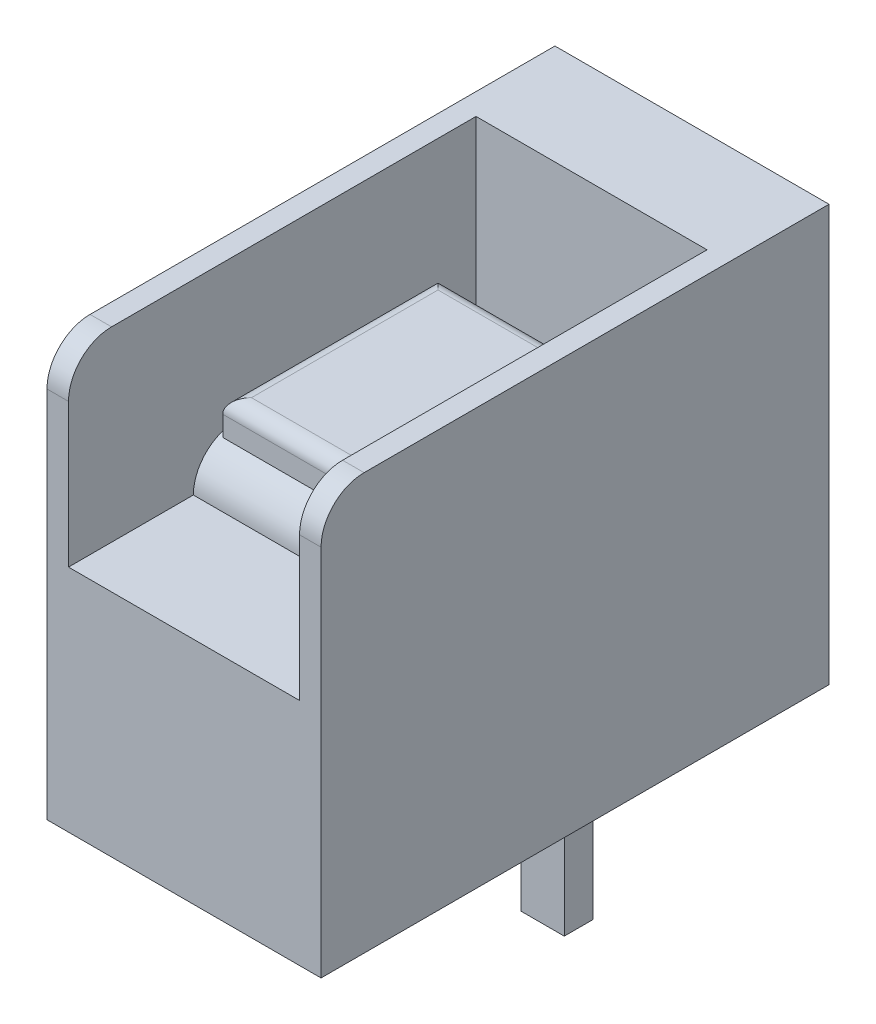
ISO-10303-21;
HEADER;
FILE_DESCRIPTION(('STEP AP214'),'2;1');
FILE_NAME('part.step','',(''),(''),'','','');
FILE_SCHEMA(('AUTOMOTIVE_DESIGN { 1 0 10303 214 1 1 1 1 }'));
ENDSEC;
DATA;
#1=APPLICATION_CONTEXT('core data for automotive mechanical design processes');
#2=APPLICATION_PROTOCOL_DEFINITION('international standard','automotive_design',2000,#1);
#3=PRODUCT_CONTEXT('',#1,'mechanical');
#4=PRODUCT('Part','Part','',(#3));
#5=PRODUCT_RELATED_PRODUCT_CATEGORY('part','',(#4));
#6=PRODUCT_DEFINITION_FORMATION('','',#4);
#7=PRODUCT_DEFINITION_CONTEXT('part definition',#1,'design');
#8=PRODUCT_DEFINITION('design','',#6,#7);
#9=PRODUCT_DEFINITION_SHAPE('','',#8);
#10=(LENGTH_UNIT() NAMED_UNIT(*) SI_UNIT(.MILLI.,.METRE.));
#11=(NAMED_UNIT(*) PLANE_ANGLE_UNIT() SI_UNIT($,.RADIAN.));
#12=(NAMED_UNIT(*) SI_UNIT($,.STERADIAN.) SOLID_ANGLE_UNIT());
#13=UNCERTAINTY_MEASURE_WITH_UNIT(LENGTH_MEASURE(1.E-05),#10,'distance_accuracy_value','');
#14=(GEOMETRIC_REPRESENTATION_CONTEXT(3) GLOBAL_UNCERTAINTY_ASSIGNED_CONTEXT((#13)) GLOBAL_UNIT_ASSIGNED_CONTEXT((#10,
#11,#12)) REPRESENTATION_CONTEXT('',''));
#15=CARTESIAN_POINT('',(0.,0.,0.));
#16=DIRECTION('',(0.,0.,1.));
#17=DIRECTION('',(1.,0.,0.));
#18=AXIS2_PLACEMENT_3D('',#15,#16,#17);
#19=CARTESIAN_POINT('',(-4.775,0.,8.85));
#20=DIRECTION('',(0.,1.,0.));
#21=DIRECTION('',(0.,0.,1.));
#22=AXIS2_PLACEMENT_3D('',#19,#20,#21);
#23=PLANE('',#22);
#24=DIRECTION('',(-1.,0.,0.));
#25=VECTOR('',#24,1.);
#26=CARTESIAN_POINT('',(4.025,0.,-6.35));
#27=LINE('',#26,#25);
#28=CARTESIAN_POINT('',(4.025,0.,-6.35));
#29=VERTEX_POINT('',#28);
#30=CARTESIAN_POINT('',(-4.025,0.,-6.35));
#31=VERTEX_POINT('',#30);
#32=EDGE_CURVE('E303',#29,#31,#27,.T.);
#33=ORIENTED_EDGE('',*,*,#32,.F.);
#34=DIRECTION('',(0.,0.,-1.));
#35=VECTOR('',#34,1.);
#36=CARTESIAN_POINT('',(4.025,0.,-6.35));
#37=LINE('',#36,#35);
#38=CARTESIAN_POINT('',(4.025,0.,-8.85));
#39=VERTEX_POINT('',#38);
#40=EDGE_CURVE('E313',#29,#39,#37,.T.);
#41=ORIENTED_EDGE('',*,*,#40,.T.);
#42=DIRECTION('',(-1.,0.,0.));
#43=VECTOR('',#42,1.);
#44=CARTESIAN_POINT('',(-4.775,0.,-8.85));
#45=LINE('',#44,#43);
#46=CARTESIAN_POINT('',(4.775,0.,-8.85));
#47=VERTEX_POINT('',#46);
#48=EDGE_CURVE('E366',#47,#39,#45,.T.);
#49=ORIENTED_EDGE('',*,*,#48,.F.);
#50=DIRECTION('',(0.,0.,-1.));
#51=VECTOR('',#50,1.);
#52=CARTESIAN_POINT('',(4.775,0.,-8.85));
#53=LINE('',#52,#51);
#54=CARTESIAN_POINT('',(4.775,0.,8.85));
#55=VERTEX_POINT('',#54);
#56=EDGE_CURVE('E376',#55,#47,#53,.T.);
#57=ORIENTED_EDGE('',*,*,#56,.F.);
#58=DIRECTION('',(1.,0.,0.));
#59=VECTOR('',#58,1.);
#60=CARTESIAN_POINT('',(-4.775,0.,8.85));
#61=LINE('',#60,#59);
#62=CARTESIAN_POINT('',(-4.775,0.,8.85));
#63=VERTEX_POINT('',#62);
#64=EDGE_CURVE('E373',#63,#55,#61,.T.);
#65=ORIENTED_EDGE('',*,*,#64,.F.);
#66=DIRECTION('',(0.,0.,1.));
#67=VECTOR('',#66,1.);
#68=CARTESIAN_POINT('',(-4.775,0.,-8.85));
#69=LINE('',#68,#67);
#70=CARTESIAN_POINT('',(-4.775,0.,-8.85));
#71=VERTEX_POINT('',#70);
#72=EDGE_CURVE('E354',#71,#63,#69,.T.);
#73=ORIENTED_EDGE('',*,*,#72,.F.);
#74=CARTESIAN_POINT('',(-4.025,0.,-8.85));
#75=VERTEX_POINT('',#74);
#76=EDGE_CURVE('E378',#75,#71,#45,.T.);
#77=ORIENTED_EDGE('',*,*,#76,.F.);
#78=DIRECTION('',(0.,0.,-1.));
#79=VECTOR('',#78,1.);
#80=CARTESIAN_POINT('',(-4.025,0.,-6.35));
#81=LINE('',#80,#79);
#82=EDGE_CURVE('E325',#31,#75,#81,.T.);
#83=ORIENTED_EDGE('',*,*,#82,.F.);
#84=EDGE_LOOP('',(#33,#41,#49,#57,#65,#73,#77,#83));
#85=FACE_BOUND('',#84,.T.);
#86=DIRECTION('',(0.,0.,-1.));
#87=VECTOR('',#86,1.);
#88=CARTESIAN_POINT('',(-0.749999999999998,0.,-3.65));
#89=LINE('',#88,#87);
#90=CARTESIAN_POINT('',(-0.749999999999998,0.,-3.65));
#91=VERTEX_POINT('',#90);
#92=CARTESIAN_POINT('',(-0.749999999999998,0.,-4.65));
#93=VERTEX_POINT('',#92);
#94=EDGE_CURVE('E253',#91,#93,#89,.T.);
#95=ORIENTED_EDGE('',*,*,#94,.F.);
#96=DIRECTION('',(-1.,0.,0.));
#97=VECTOR('',#96,1.);
#98=CARTESIAN_POINT('',(-0.749999999999998,0.,-3.65));
#99=LINE('',#98,#97);
#100=CARTESIAN_POINT('',(0.750000000000002,0.,-3.65));
#101=VERTEX_POINT('',#100);
#102=EDGE_CURVE('E250',#101,#91,#99,.T.);
#103=ORIENTED_EDGE('',*,*,#102,.F.);
#104=DIRECTION('',(0.,0.,1.));
#105=VECTOR('',#104,1.);
#106=CARTESIAN_POINT('',(0.750000000000002,0.,-3.65));
#107=LINE('',#106,#105);
#108=CARTESIAN_POINT('',(0.750000000000002,0.,-4.65));
#109=VERTEX_POINT('',#108);
#110=EDGE_CURVE('E57',#109,#101,#107,.T.);
#111=ORIENTED_EDGE('',*,*,#110,.F.);
#112=DIRECTION('',(1.,0.,0.));
#113=VECTOR('',#112,1.);
#114=CARTESIAN_POINT('',(-0.749999999999998,0.,-4.65));
#115=LINE('',#114,#113);
#116=EDGE_CURVE('E52',#93,#109,#115,.T.);
#117=ORIENTED_EDGE('',*,*,#116,.F.);
#118=EDGE_LOOP('',(#95,#103,#111,#117));
#119=FACE_BOUND('',#118,.T.);
#120=ADVANCED_FACE('F35',(#85,#119),#23,.F.);
#121=CARTESIAN_POINT('',(4.025,9.5,-4.5));
#122=DIRECTION('',(0.,-1.,0.));
#123=DIRECTION('',(0.,0.,-1.));
#124=AXIS2_PLACEMENT_3D('',#121,#122,#123);
#125=PLANE('',#124);
#126=DIRECTION('',(0.,0.,-1.));
#127=VECTOR('',#126,1.);
#128=CARTESIAN_POINT('',(3.75,9.5,3.75));
#129=LINE('',#128,#127);
#130=CARTESIAN_POINT('',(3.75,9.5,3.));
#131=VERTEX_POINT('',#130);
#132=CARTESIAN_POINT('',(3.75,9.5,-3.));
#133=VERTEX_POINT('',#132);
#134=EDGE_CURVE('E266',#131,#133,#129,.T.);
#135=ORIENTED_EDGE('',*,*,#134,.F.);
#136=DIRECTION('',(1.,0.,0.));
#137=VECTOR('',#136,1.);
#138=CARTESIAN_POINT('',(4.025,9.5,3.));
#139=LINE('',#138,#137);
#140=CARTESIAN_POINT('',(4.025,9.5,3.));
#141=VERTEX_POINT('',#140);
#142=EDGE_CURVE('E408',#131,#141,#139,.T.);
#143=ORIENTED_EDGE('',*,*,#142,.T.);
#144=DIRECTION('',(0.,0.,-1.));
#145=VECTOR('',#144,1.);
#146=CARTESIAN_POINT('',(4.025,9.5,-4.5));
#147=LINE('',#146,#145);
#148=CARTESIAN_POINT('',(4.025,9.5,-3.));
#149=VERTEX_POINT('',#148);
#150=EDGE_CURVE('E289',#141,#149,#147,.T.);
#151=ORIENTED_EDGE('',*,*,#150,.T.);
#152=DIRECTION('',(-1.,0.,0.));
#153=VECTOR('',#152,1.);
#154=CARTESIAN_POINT('',(4.025,9.5,-3.));
#155=LINE('',#154,#153);
#156=EDGE_CURVE('E414',#149,#133,#155,.T.);
#157=ORIENTED_EDGE('',*,*,#156,.T.);
#158=EDGE_LOOP('',(#135,#143,#151,#157));
#159=FACE_BOUND('',#158,.T.);
#160=ADVANCED_FACE('F462',(#159),#125,.F.);
#161=DIRECTION('',(0.,0.,1.));
#162=VECTOR('',#161,1.);
#163=CARTESIAN_POINT('',(-3.75,9.5,3.75));
#164=LINE('',#163,#162);
#165=CARTESIAN_POINT('',(-3.75,9.5,-3.));
#166=VERTEX_POINT('',#165);
#167=CARTESIAN_POINT('',(-3.75,9.5,3.));
#168=VERTEX_POINT('',#167);
#169=EDGE_CURVE('E275',#166,#168,#164,.T.);
#170=ORIENTED_EDGE('',*,*,#169,.F.);
#171=CARTESIAN_POINT('',(-4.025,9.5,-3.));
#172=VERTEX_POINT('',#171);
#173=EDGE_CURVE('E412',#166,#172,#155,.T.);
#174=ORIENTED_EDGE('',*,*,#173,.T.);
#175=DIRECTION('',(0.,0.,1.));
#176=VECTOR('',#175,1.);
#177=CARTESIAN_POINT('',(-4.025,9.5,-4.5));
#178=LINE('',#177,#176);
#179=CARTESIAN_POINT('',(-4.025,9.5,3.));
#180=VERTEX_POINT('',#179);
#181=EDGE_CURVE('E292',#172,#180,#178,.T.);
#182=ORIENTED_EDGE('',*,*,#181,.T.);
#183=EDGE_CURVE('E409',#180,#168,#139,.T.);
#184=ORIENTED_EDGE('',*,*,#183,.T.);
#185=EDGE_LOOP('',(#170,#174,#182,#184));
#186=FACE_BOUND('',#185,.T.);
#187=ADVANCED_FACE('F476',(#186),#125,.F.);
#188=CARTESIAN_POINT('',(4.025,8.,8.85));
#189=DIRECTION('',(1.,0.,0.));
#190=DIRECTION('',(0.,0.,-1.));
#191=AXIS2_PLACEMENT_3D('',#188,#189,#190);
#192=PLANE('',#191);
#193=DIRECTION('',(0.,0.,-1.));
#194=VECTOR('',#193,1.);
#195=CARTESIAN_POINT('',(4.025,8.,8.85));
#196=LINE('',#195,#194);
#197=CARTESIAN_POINT('',(4.025,8.,-4.5));
#198=VERTEX_POINT('',#197);
#199=CARTESIAN_POINT('',(4.025,8.,-5.35));
#200=VERTEX_POINT('',#199);
#201=EDGE_CURVE('E333',#198,#200,#196,.T.);
#202=ORIENTED_EDGE('',*,*,#201,.F.);
#203=CARTESIAN_POINT('',(4.025,8.,-3.));
#204=DIRECTION('',(1.,0.,0.));
#205=DIRECTION('',(0.,0.,-1.));
#206=AXIS2_PLACEMENT_3D('',#203,#204,#205);
#207=CIRCLE('',#206,1.5);
#208=EDGE_CURVE('E419',#198,#149,#207,.T.);
#209=ORIENTED_EDGE('',*,*,#208,.T.);
#210=ORIENTED_EDGE('',*,*,#150,.F.);
#211=CARTESIAN_POINT('',(4.025,8.,3.));
#212=DIRECTION('',(1.,0.,0.));
#213=DIRECTION('',(0.,0.,-1.));
#214=AXIS2_PLACEMENT_3D('',#211,#212,#213);
#215=CIRCLE('',#214,1.5);
#216=CARTESIAN_POINT('',(4.025,8.,4.5));
#217=VERTEX_POINT('',#216);
#218=EDGE_CURVE('E421',#141,#217,#215,.T.);
#219=ORIENTED_EDGE('',*,*,#218,.T.);
#220=CARTESIAN_POINT('',(4.025,8.,8.85));
#221=VERTEX_POINT('',#220);
#222=EDGE_CURVE('E329',#221,#217,#196,.T.);
#223=ORIENTED_EDGE('',*,*,#222,.F.);
#224=DIRECTION('',(0.,1.,0.));
#225=VECTOR('',#224,1.);
#226=CARTESIAN_POINT('',(4.025,8.,8.85));
#227=LINE('',#226,#225);
#228=CARTESIAN_POINT('',(4.025,13.,8.85));
#229=VERTEX_POINT('',#228);
#230=EDGE_CURVE('E351',#221,#229,#227,.T.);
#231=ORIENTED_EDGE('',*,*,#230,.T.);
#232=CARTESIAN_POINT('',(4.025,13.,7.35));
#233=DIRECTION('',(1.,0.,0.));
#234=DIRECTION('',(0.,0.,-1.));
#235=AXIS2_PLACEMENT_3D('',#232,#233,#234);
#236=CIRCLE('',#235,1.5);
#237=CARTESIAN_POINT('',(4.025,14.5,7.35));
#238=VERTEX_POINT('',#237);
#239=EDGE_CURVE('E402',#229,#238,#236,.F.);
#240=ORIENTED_EDGE('',*,*,#239,.T.);
#241=DIRECTION('',(0.,0.,-1.));
#242=VECTOR('',#241,1.);
#243=CARTESIAN_POINT('',(4.025,14.5,8.85));
#244=LINE('',#243,#242);
#245=CARTESIAN_POINT('',(4.025,14.5,-5.35));
#246=VERTEX_POINT('',#245);
#247=EDGE_CURVE('E322',#238,#246,#244,.T.);
#248=ORIENTED_EDGE('',*,*,#247,.T.);
#249=DIRECTION('',(0.,1.,0.));
#250=VECTOR('',#249,1.);
#251=CARTESIAN_POINT('',(4.025,8.,-5.35));
#252=LINE('',#251,#250);
#253=EDGE_CURVE('E343',#200,#246,#252,.T.);
#254=ORIENTED_EDGE('',*,*,#253,.F.);
#255=EDGE_LOOP('',(#202,#209,#210,#219,#223,#231,#240,#248,#254));
#256=FACE_BOUND('',#255,.T.);
#257=ADVANCED_FACE('F492',(#256),#192,.F.);
#258=CARTESIAN_POINT('',(-4.025,8.,8.85));
#259=DIRECTION('',(-1.,0.,0.));
#260=DIRECTION('',(0.,0.,1.));
#261=AXIS2_PLACEMENT_3D('',#258,#259,#260);
#262=PLANE('',#261);
#263=ORIENTED_EDGE('',*,*,#181,.F.);
#264=CARTESIAN_POINT('',(-4.025,8.,-3.));
#265=DIRECTION('',(-1.,0.,0.));
#266=DIRECTION('',(0.,0.,1.));
#267=AXIS2_PLACEMENT_3D('',#264,#265,#266);
#268=CIRCLE('',#267,1.5);
#269=CARTESIAN_POINT('',(-4.025,8.,-4.5));
#270=VERTEX_POINT('',#269);
#271=EDGE_CURVE('E417',#172,#270,#268,.T.);
#272=ORIENTED_EDGE('',*,*,#271,.T.);
#273=DIRECTION('',(0.,0.,1.));
#274=VECTOR('',#273,1.);
#275=CARTESIAN_POINT('',(-4.025,8.,8.85));
#276=LINE('',#275,#274);
#277=CARTESIAN_POINT('',(-4.025,8.,-5.35));
#278=VERTEX_POINT('',#277);
#279=EDGE_CURVE('E337',#278,#270,#276,.T.);
#280=ORIENTED_EDGE('',*,*,#279,.F.);
#281=DIRECTION('',(0.,1.,0.));
#282=VECTOR('',#281,1.);
#283=CARTESIAN_POINT('',(-4.025,8.,-5.35));
#284=LINE('',#283,#282);
#285=CARTESIAN_POINT('',(-4.025,14.5,-5.35));
#286=VERTEX_POINT('',#285);
#287=EDGE_CURVE('E358',#278,#286,#284,.T.);
#288=ORIENTED_EDGE('',*,*,#287,.T.);
#289=DIRECTION('',(0.,0.,1.));
#290=VECTOR('',#289,1.);
#291=CARTESIAN_POINT('',(-4.025,14.5,8.85));
#292=LINE('',#291,#290);
#293=CARTESIAN_POINT('',(-4.025,14.5,7.35));
#294=VERTEX_POINT('',#293);
#295=EDGE_CURVE('E348',#286,#294,#292,.T.);
#296=ORIENTED_EDGE('',*,*,#295,.T.);
#297=CARTESIAN_POINT('',(-4.025,13.,7.35));
#298=DIRECTION('',(-1.,0.,0.));
#299=DIRECTION('',(0.,0.,1.));
#300=AXIS2_PLACEMENT_3D('',#297,#298,#299);
#301=CIRCLE('',#300,1.5);
#302=CARTESIAN_POINT('',(-4.025,13.,8.85));
#303=VERTEX_POINT('',#302);
#304=EDGE_CURVE('E404',#294,#303,#301,.F.);
#305=ORIENTED_EDGE('',*,*,#304,.T.);
#306=DIRECTION('',(0.,1.,0.));
#307=VECTOR('',#306,1.);
#308=CARTESIAN_POINT('',(-4.025,8.,8.85));
#309=LINE('',#308,#307);
#310=CARTESIAN_POINT('',(-4.025,8.,8.85));
#311=VERTEX_POINT('',#310);
#312=EDGE_CURVE('E355',#311,#303,#309,.T.);
#313=ORIENTED_EDGE('',*,*,#312,.F.);
#314=CARTESIAN_POINT('',(-4.025,8.,4.5));
#315=VERTEX_POINT('',#314);
#316=EDGE_CURVE('E336',#315,#311,#276,.T.);
#317=ORIENTED_EDGE('',*,*,#316,.F.);
#318=CARTESIAN_POINT('',(-4.025,8.,3.));
#319=DIRECTION('',(-1.,0.,0.));
#320=DIRECTION('',(0.,0.,1.));
#321=AXIS2_PLACEMENT_3D('',#318,#319,#320);
#322=CIRCLE('',#321,1.5);
#323=EDGE_CURVE('E423',#315,#180,#322,.T.);
#324=ORIENTED_EDGE('',*,*,#323,.T.);
#325=EDGE_LOOP('',(#263,#272,#280,#288,#296,#305,#313,#317,#324));
#326=FACE_BOUND('',#325,.T.);
#327=ADVANCED_FACE('F481',(#326),#262,.F.);
#328=CARTESIAN_POINT('',(4.025,8.,-5.35));
#329=DIRECTION('',(0.,1.,0.));
#330=DIRECTION('',(0.,0.,1.));
#331=AXIS2_PLACEMENT_3D('',#328,#329,#330);
#332=PLANE('',#331);
#333=ORIENTED_EDGE('',*,*,#279,.T.);
#334=DIRECTION('',(-1.,0.,0.));
#335=VECTOR('',#334,1.);
#336=CARTESIAN_POINT('',(4.025,8.,-4.5));
#337=LINE('',#336,#335);
#338=EDGE_CURVE('E288',#198,#270,#337,.T.);
#339=ORIENTED_EDGE('',*,*,#338,.F.);
#340=ORIENTED_EDGE('',*,*,#201,.T.);
#341=DIRECTION('',(-1.,0.,0.));
#342=VECTOR('',#341,1.);
#343=CARTESIAN_POINT('',(4.025,8.,-5.35));
#344=LINE('',#343,#342);
#345=EDGE_CURVE('E332',#200,#278,#344,.T.);
#346=ORIENTED_EDGE('',*,*,#345,.T.);
#347=EDGE_LOOP('',(#333,#339,#340,#346));
#348=FACE_BOUND('',#347,.T.);
#349=ADVANCED_FACE('F724',(#348),#332,.T.);
#350=ORIENTED_EDGE('',*,*,#222,.T.);
#351=DIRECTION('',(1.,0.,0.));
#352=VECTOR('',#351,1.);
#353=CARTESIAN_POINT('',(4.025,8.,4.5));
#354=LINE('',#353,#352);
#355=EDGE_CURVE('E293',#315,#217,#354,.T.);
#356=ORIENTED_EDGE('',*,*,#355,.F.);
#357=ORIENTED_EDGE('',*,*,#316,.T.);
#358=DIRECTION('',(1.,0.,0.));
#359=VECTOR('',#358,1.);
#360=CARTESIAN_POINT('',(4.025,8.,8.85));
#361=LINE('',#360,#359);
#362=EDGE_CURVE('E340',#311,#221,#361,.T.);
#363=ORIENTED_EDGE('',*,*,#362,.T.);
#364=EDGE_LOOP('',(#350,#356,#357,#363));
#365=FACE_BOUND('',#364,.T.);
#366=ADVANCED_FACE('F487',(#365),#332,.T.);
#367=CARTESIAN_POINT('',(-4.775,14.5,-8.85));
#368=DIRECTION('',(1.,0.,0.));
#369=DIRECTION('',(0.,0.,-1.));
#370=AXIS2_PLACEMENT_3D('',#367,#368,#369);
#371=PLANE('',#370);
#372=DIRECTION('',(0.,-1.,0.));
#373=VECTOR('',#372,1.);
#374=CARTESIAN_POINT('',(-4.775,14.5,8.85));
#375=LINE('',#374,#373);
#376=CARTESIAN_POINT('',(-4.775,13.,8.85));
#377=VERTEX_POINT('',#376);
#378=EDGE_CURVE('E388',#377,#63,#375,.T.);
#379=ORIENTED_EDGE('',*,*,#378,.F.);
#380=CARTESIAN_POINT('',(-4.775,13.,7.35));
#381=DIRECTION('',(1.,0.,0.));
#382=DIRECTION('',(0.,0.,-1.));
#383=AXIS2_PLACEMENT_3D('',#380,#381,#382);
#384=CIRCLE('',#383,1.5);
#385=CARTESIAN_POINT('',(-4.775,14.5,7.35));
#386=VERTEX_POINT('',#385);
#387=EDGE_CURVE('E406',#377,#386,#384,.F.);
#388=ORIENTED_EDGE('',*,*,#387,.T.);
#389=DIRECTION('',(0.,0.,1.));
#390=VECTOR('',#389,1.);
#391=CARTESIAN_POINT('',(-4.775,14.5,-8.85));
#392=LINE('',#391,#390);
#393=CARTESIAN_POINT('',(-4.775,14.5,-8.85));
#394=VERTEX_POINT('',#393);
#395=EDGE_CURVE('E362',#394,#386,#392,.T.);
#396=ORIENTED_EDGE('',*,*,#395,.F.);
#397=DIRECTION('',(0.,-1.,0.));
#398=VECTOR('',#397,1.);
#399=CARTESIAN_POINT('',(-4.775,14.5,-8.85));
#400=LINE('',#399,#398);
#401=EDGE_CURVE('E370',#394,#71,#400,.T.);
#402=ORIENTED_EDGE('',*,*,#401,.T.);
#403=ORIENTED_EDGE('',*,*,#72,.T.);
#404=EDGE_LOOP('',(#379,#388,#396,#402,#403));
#405=FACE_BOUND('',#404,.T.);
#406=ADVANCED_FACE('F552',(#405),#371,.F.);
#407=CARTESIAN_POINT('',(-4.775,14.5,8.85));
#408=DIRECTION('',(0.,0.,-1.));
#409=DIRECTION('',(-1.,0.,0.));
#410=AXIS2_PLACEMENT_3D('',#407,#408,#409);
#411=PLANE('',#410);
#412=DIRECTION('',(0.,-1.,0.));
#413=VECTOR('',#412,1.);
#414=CARTESIAN_POINT('',(4.775,14.5,8.85));
#415=LINE('',#414,#413);
#416=CARTESIAN_POINT('',(4.775,13.,8.85));
#417=VERTEX_POINT('',#416);
#418=EDGE_CURVE('E386',#417,#55,#415,.T.);
#419=ORIENTED_EDGE('',*,*,#418,.F.);
#420=DIRECTION('',(1.,0.,0.));
#421=VECTOR('',#420,1.);
#422=CARTESIAN_POINT('',(4.025,13.,8.85));
#423=LINE('',#422,#421);
#424=EDGE_CURVE('E400',#417,#229,#423,.F.);
#425=ORIENTED_EDGE('',*,*,#424,.T.);
#426=ORIENTED_EDGE('',*,*,#230,.F.);
#427=ORIENTED_EDGE('',*,*,#362,.F.);
#428=ORIENTED_EDGE('',*,*,#312,.T.);
#429=DIRECTION('',(1.,0.,0.));
#430=VECTOR('',#429,1.);
#431=CARTESIAN_POINT('',(-4.775,13.,8.85));
#432=LINE('',#431,#430);
#433=EDGE_CURVE('E398',#303,#377,#432,.F.);
#434=ORIENTED_EDGE('',*,*,#433,.T.);
#435=ORIENTED_EDGE('',*,*,#378,.T.);
#436=ORIENTED_EDGE('',*,*,#64,.T.);
#437=EDGE_LOOP('',(#419,#425,#426,#427,#428,#434,#435,#436));
#438=FACE_BOUND('',#437,.T.);
#439=ADVANCED_FACE('F548',(#438),#411,.F.);
#440=CARTESIAN_POINT('',(4.775,14.5,-8.85));
#441=DIRECTION('',(-1.,0.,0.));
#442=DIRECTION('',(0.,0.,1.));
#443=AXIS2_PLACEMENT_3D('',#440,#441,#442);
#444=PLANE('',#443);
#445=DIRECTION('',(0.,0.,-1.));
#446=VECTOR('',#445,1.);
#447=CARTESIAN_POINT('',(4.775,14.5,-8.85));
#448=LINE('',#447,#446);
#449=CARTESIAN_POINT('',(4.775,14.5,7.35));
#450=VERTEX_POINT('',#449);
#451=CARTESIAN_POINT('',(4.775,14.5,-8.85));
#452=VERTEX_POINT('',#451);
#453=EDGE_CURVE('E365',#450,#452,#448,.T.);
#454=ORIENTED_EDGE('',*,*,#453,.F.);
#455=CARTESIAN_POINT('',(4.775,13.,7.35));
#456=DIRECTION('',(-1.,0.,0.));
#457=DIRECTION('',(0.,0.,1.));
#458=AXIS2_PLACEMENT_3D('',#455,#456,#457);
#459=CIRCLE('',#458,1.5);
#460=EDGE_CURVE('E396',#450,#417,#459,.F.);
#461=ORIENTED_EDGE('',*,*,#460,.T.);
#462=ORIENTED_EDGE('',*,*,#418,.T.);
#463=ORIENTED_EDGE('',*,*,#56,.T.);
#464=DIRECTION('',(0.,-1.,0.));
#465=VECTOR('',#464,1.);
#466=CARTESIAN_POINT('',(4.775,14.5,-8.85));
#467=LINE('',#466,#465);
#468=EDGE_CURVE('E383',#452,#47,#467,.T.);
#469=ORIENTED_EDGE('',*,*,#468,.F.);
#470=EDGE_LOOP('',(#454,#461,#462,#463,#469));
#471=FACE_BOUND('',#470,.T.);
#472=ADVANCED_FACE('F544',(#471),#444,.F.);
#473=CARTESIAN_POINT('',(-4.775,14.5,-8.85));
#474=DIRECTION('',(0.,0.,1.));
#475=DIRECTION('',(1.,0.,0.));
#476=AXIS2_PLACEMENT_3D('',#473,#474,#475);
#477=PLANE('',#476);
#478=ORIENTED_EDGE('',*,*,#48,.T.);
#479=DIRECTION('',(0.,-1.,0.));
#480=VECTOR('',#479,1.);
#481=CARTESIAN_POINT('',(4.025,13.3,-8.85));
#482=LINE('',#481,#480);
#483=CARTESIAN_POINT('',(4.025,13.3,-8.85));
#484=VERTEX_POINT('',#483);
#485=EDGE_CURVE('E296',#484,#39,#482,.T.);
#486=ORIENTED_EDGE('',*,*,#485,.F.);
#487=DIRECTION('',(1.,0.,0.));
#488=VECTOR('',#487,1.);
#489=CARTESIAN_POINT('',(4.025,13.3,-8.85));
#490=LINE('',#489,#488);
#491=CARTESIAN_POINT('',(-4.025,13.3,-8.85));
#492=VERTEX_POINT('',#491);
#493=EDGE_CURVE('E304',#492,#484,#490,.T.);
#494=ORIENTED_EDGE('',*,*,#493,.F.);
#495=DIRECTION('',(0.,1.,0.));
#496=VECTOR('',#495,1.);
#497=CARTESIAN_POINT('',(-4.025,13.3,-8.85));
#498=LINE('',#497,#496);
#499=EDGE_CURVE('E315',#75,#492,#498,.T.);
#500=ORIENTED_EDGE('',*,*,#499,.F.);
#501=ORIENTED_EDGE('',*,*,#76,.T.);
#502=ORIENTED_EDGE('',*,*,#401,.F.);
#503=DIRECTION('',(-1.,0.,0.));
#504=VECTOR('',#503,1.);
#505=CARTESIAN_POINT('',(-4.775,14.5,-8.85));
#506=LINE('',#505,#504);
#507=EDGE_CURVE('E368',#452,#394,#506,.T.);
#508=ORIENTED_EDGE('',*,*,#507,.F.);
#509=ORIENTED_EDGE('',*,*,#468,.T.);
#510=EDGE_LOOP('',(#478,#486,#494,#500,#501,#502,#508,#509));
#511=FACE_BOUND('',#510,.T.);
#512=ADVANCED_FACE('F541',(#511),#477,.F.);
#513=CARTESIAN_POINT('',(-4.775,14.5,8.85));
#514=DIRECTION('',(0.,1.,0.));
#515=DIRECTION('',(0.,0.,1.));
#516=AXIS2_PLACEMENT_3D('',#513,#514,#515);
#517=PLANE('',#516);
#518=ORIENTED_EDGE('',*,*,#247,.F.);
#519=DIRECTION('',(1.,0.,0.));
#520=VECTOR('',#519,1.);
#521=CARTESIAN_POINT('',(4.775,14.5,7.35));
#522=LINE('',#521,#520);
#523=EDGE_CURVE('E393',#238,#450,#522,.T.);
#524=ORIENTED_EDGE('',*,*,#523,.T.);
#525=ORIENTED_EDGE('',*,*,#453,.T.);
#526=ORIENTED_EDGE('',*,*,#507,.T.);
#527=ORIENTED_EDGE('',*,*,#395,.T.);
#528=DIRECTION('',(1.,0.,0.));
#529=VECTOR('',#528,1.);
#530=CARTESIAN_POINT('',(-4.025,14.5,7.35));
#531=LINE('',#530,#529);
#532=EDGE_CURVE('E390',#386,#294,#531,.T.);
#533=ORIENTED_EDGE('',*,*,#532,.T.);
#534=ORIENTED_EDGE('',*,*,#295,.F.);
#535=DIRECTION('',(-1.,0.,0.));
#536=VECTOR('',#535,1.);
#537=CARTESIAN_POINT('',(4.025,14.5,-5.35));
#538=LINE('',#537,#536);
#539=EDGE_CURVE('E345',#246,#286,#538,.T.);
#540=ORIENTED_EDGE('',*,*,#539,.F.);
#541=EDGE_LOOP('',(#518,#524,#525,#526,#527,#533,#534,#540));
#542=FACE_BOUND('',#541,.T.);
#543=ADVANCED_FACE('F539',(#542),#517,.T.);
#544=CARTESIAN_POINT('',(4.025,8.,-5.35));
#545=DIRECTION('',(0.,0.,-1.));
#546=DIRECTION('',(-1.,0.,0.));
#547=AXIS2_PLACEMENT_3D('',#544,#545,#546);
#548=PLANE('',#547);
#549=ORIENTED_EDGE('',*,*,#539,.T.);
#550=ORIENTED_EDGE('',*,*,#287,.F.);
#551=ORIENTED_EDGE('',*,*,#345,.F.);
#552=ORIENTED_EDGE('',*,*,#253,.T.);
#553=EDGE_LOOP('',(#549,#550,#551,#552));
#554=FACE_BOUND('',#553,.T.);
#555=ADVANCED_FACE('F783',(#554),#548,.F.);
#556=CARTESIAN_POINT('',(4.025,13.3,-6.35));
#557=DIRECTION('',(1.,0.,0.));
#558=DIRECTION('',(0.,0.,-1.));
#559=AXIS2_PLACEMENT_3D('',#556,#557,#558);
#560=PLANE('',#559);
#561=ORIENTED_EDGE('',*,*,#485,.T.);
#562=ORIENTED_EDGE('',*,*,#40,.F.);
#563=DIRECTION('',(0.,-1.,0.));
#564=VECTOR('',#563,1.);
#565=CARTESIAN_POINT('',(4.025,13.3,-6.35));
#566=LINE('',#565,#564);
#567=CARTESIAN_POINT('',(4.025,13.3,-6.35));
#568=VERTEX_POINT('',#567);
#569=EDGE_CURVE('E301',#568,#29,#566,.T.);
#570=ORIENTED_EDGE('',*,*,#569,.F.);
#571=DIRECTION('',(0.,0.,-1.));
#572=VECTOR('',#571,1.);
#573=CARTESIAN_POINT('',(4.025,13.3,-6.35));
#574=LINE('',#573,#572);
#575=EDGE_CURVE('E320',#568,#484,#574,.T.);
#576=ORIENTED_EDGE('',*,*,#575,.T.);
#577=EDGE_LOOP('',(#561,#562,#570,#576));
#578=FACE_BOUND('',#577,.T.);
#579=ADVANCED_FACE('F774',(#578),#560,.F.);
#580=CARTESIAN_POINT('',(4.025,13.3,-6.35));
#581=DIRECTION('',(0.,1.,0.));
#582=DIRECTION('',(0.,0.,1.));
#583=AXIS2_PLACEMENT_3D('',#580,#581,#582);
#584=PLANE('',#583);
#585=ORIENTED_EDGE('',*,*,#493,.T.);
#586=ORIENTED_EDGE('',*,*,#575,.F.);
#587=DIRECTION('',(1.,0.,0.));
#588=VECTOR('',#587,1.);
#589=CARTESIAN_POINT('',(4.025,13.3,-6.35));
#590=LINE('',#589,#588);
#591=CARTESIAN_POINT('',(-4.025,13.3,-6.35));
#592=VERTEX_POINT('',#591);
#593=EDGE_CURVE('E310',#592,#568,#590,.T.);
#594=ORIENTED_EDGE('',*,*,#593,.F.);
#595=DIRECTION('',(0.,0.,-1.));
#596=VECTOR('',#595,1.);
#597=CARTESIAN_POINT('',(-4.025,13.3,-6.35));
#598=LINE('',#597,#596);
#599=EDGE_CURVE('E323',#592,#492,#598,.T.);
#600=ORIENTED_EDGE('',*,*,#599,.T.);
#601=EDGE_LOOP('',(#585,#586,#594,#600));
#602=FACE_BOUND('',#601,.T.);
#603=ADVANCED_FACE('F765',(#602),#584,.F.);
#604=CARTESIAN_POINT('',(-4.025,13.3,-6.35));
#605=DIRECTION('',(-1.,0.,0.));
#606=DIRECTION('',(0.,0.,1.));
#607=AXIS2_PLACEMENT_3D('',#604,#605,#606);
#608=PLANE('',#607);
#609=ORIENTED_EDGE('',*,*,#499,.T.);
#610=ORIENTED_EDGE('',*,*,#599,.F.);
#611=DIRECTION('',(0.,1.,0.));
#612=VECTOR('',#611,1.);
#613=CARTESIAN_POINT('',(-4.025,13.3,-6.35));
#614=LINE('',#613,#612);
#615=EDGE_CURVE('E307',#31,#592,#614,.T.);
#616=ORIENTED_EDGE('',*,*,#615,.F.);
#617=ORIENTED_EDGE('',*,*,#82,.T.);
#618=EDGE_LOOP('',(#609,#610,#616,#617));
#619=FACE_BOUND('',#618,.T.);
#620=ADVANCED_FACE('F755',(#619),#608,.F.);
#621=CARTESIAN_POINT('',(4.025,0.,-6.35));
#622=DIRECTION('',(0.,0.,-1.));
#623=DIRECTION('',(-1.,0.,0.));
#624=AXIS2_PLACEMENT_3D('',#621,#622,#623);
#625=PLANE('',#624);
#626=ORIENTED_EDGE('',*,*,#569,.T.);
#627=ORIENTED_EDGE('',*,*,#32,.T.);
#628=ORIENTED_EDGE('',*,*,#615,.T.);
#629=ORIENTED_EDGE('',*,*,#593,.T.);
#630=EDGE_LOOP('',(#626,#627,#628,#629));
#631=FACE_BOUND('',#630,.T.);
#632=ADVANCED_FACE('F561',(#631),#625,.T.);
#633=CARTESIAN_POINT('',(-4.775,13.,7.35));
#634=DIRECTION('',(-1.,0.,0.));
#635=DIRECTION('',(0.,0.,1.));
#636=AXIS2_PLACEMENT_3D('',#633,#634,#635);
#637=CYLINDRICAL_SURFACE('',#636,1.5);
#638=ORIENTED_EDGE('',*,*,#239,.F.);
#639=ORIENTED_EDGE('',*,*,#424,.F.);
#640=ORIENTED_EDGE('',*,*,#460,.F.);
#641=ORIENTED_EDGE('',*,*,#523,.F.);
#642=EDGE_LOOP('',(#638,#639,#640,#641));
#643=FACE_BOUND('',#642,.T.);
#644=ADVANCED_FACE('F557',(#643),#637,.T.);
#645=CARTESIAN_POINT('',(-4.775,13.,7.35));
#646=DIRECTION('',(-1.,0.,0.));
#647=DIRECTION('',(0.,0.,1.));
#648=AXIS2_PLACEMENT_3D('',#645,#646,#647);
#649=CYLINDRICAL_SURFACE('',#648,1.5);
#650=ORIENTED_EDGE('',*,*,#387,.F.);
#651=ORIENTED_EDGE('',*,*,#433,.F.);
#652=ORIENTED_EDGE('',*,*,#304,.F.);
#653=ORIENTED_EDGE('',*,*,#532,.F.);
#654=EDGE_LOOP('',(#650,#651,#652,#653));
#655=FACE_BOUND('',#654,.T.);
#656=ADVANCED_FACE('F560',(#655),#649,.T.);
#657=CARTESIAN_POINT('',(4.025,8.,-3.));
#658=DIRECTION('',(-1.,0.,0.));
#659=DIRECTION('',(0.,0.,1.));
#660=AXIS2_PLACEMENT_3D('',#657,#658,#659);
#661=CYLINDRICAL_SURFACE('',#660,1.5);
#662=ORIENTED_EDGE('',*,*,#208,.F.);
#663=ORIENTED_EDGE('',*,*,#338,.T.);
#664=ORIENTED_EDGE('',*,*,#271,.F.);
#665=ORIENTED_EDGE('',*,*,#173,.F.);
#666=DIRECTION('',(-1.,0.,0.));
#667=VECTOR('',#666,1.);
#668=CARTESIAN_POINT('',(4.025,9.5,-3.));
#669=LINE('',#668,#667);
#670=EDGE_CURVE('E286',#166,#133,#669,.F.);
#671=ORIENTED_EDGE('',*,*,#670,.T.);
#672=ORIENTED_EDGE('',*,*,#156,.F.);
#673=EDGE_LOOP('',(#662,#663,#664,#665,#671,#672));
#674=FACE_BOUND('',#673,.T.);
#675=ADVANCED_FACE('F496',(#674),#661,.T.);
#676=CARTESIAN_POINT('',(4.025,8.,3.));
#677=DIRECTION('',(1.,0.,0.));
#678=DIRECTION('',(0.,0.,-1.));
#679=AXIS2_PLACEMENT_3D('',#676,#677,#678);
#680=CYLINDRICAL_SURFACE('',#679,1.5);
#681=ORIENTED_EDGE('',*,*,#323,.F.);
#682=ORIENTED_EDGE('',*,*,#355,.T.);
#683=ORIENTED_EDGE('',*,*,#218,.F.);
#684=ORIENTED_EDGE('',*,*,#142,.F.);
#685=EDGE_CURVE('E413',#168,#131,#139,.T.);
#686=ORIENTED_EDGE('',*,*,#685,.F.);
#687=ORIENTED_EDGE('',*,*,#183,.F.);
#688=EDGE_LOOP('',(#681,#682,#683,#684,#686,#687));
#689=FACE_BOUND('',#688,.T.);
#690=ADVANCED_FACE('F474',(#689),#680,.T.);
#691=CARTESIAN_POINT('',(3.75,9.5,-3.75));
#692=DIRECTION('',(0.,1.,0.));
#693=DIRECTION('',(0.,0.,1.));
#694=AXIS2_PLACEMENT_3D('',#691,#692,#693);
#695=PLANE('',#694);
#696=ORIENTED_EDGE('',*,*,#670,.F.);
#697=CARTESIAN_POINT('',(-3.75,9.5,-3.75));
#698=VERTEX_POINT('',#697);
#699=EDGE_CURVE('E271',#698,#166,#164,.T.);
#700=ORIENTED_EDGE('',*,*,#699,.F.);
#701=DIRECTION('',(-1.,0.,0.));
#702=VECTOR('',#701,1.);
#703=CARTESIAN_POINT('',(3.75,9.5,-3.75));
#704=LINE('',#703,#702);
#705=CARTESIAN_POINT('',(3.75,9.5,-3.75));
#706=VERTEX_POINT('',#705);
#707=EDGE_CURVE('E265',#706,#698,#704,.T.);
#708=ORIENTED_EDGE('',*,*,#707,.F.);
#709=EDGE_CURVE('E267',#133,#706,#129,.T.);
#710=ORIENTED_EDGE('',*,*,#709,.F.);
#711=EDGE_LOOP('',(#696,#700,#708,#710));
#712=FACE_BOUND('',#711,.T.);
#713=ADVANCED_FACE('F500',(#712),#695,.F.);
#714=CARTESIAN_POINT('',(3.75,10.7,3.75));
#715=DIRECTION('',(-1.,0.,0.));
#716=DIRECTION('',(0.,0.,1.));
#717=AXIS2_PLACEMENT_3D('',#714,#715,#716);
#718=PLANE('',#717);
#719=DIRECTION('',(0.,-1.,0.));
#720=VECTOR('',#719,1.);
#721=CARTESIAN_POINT('',(3.75,10.7,-3.75));
#722=LINE('',#721,#720);
#723=CARTESIAN_POINT('',(3.75,10.2,-3.75));
#724=VERTEX_POINT('',#723);
#725=EDGE_CURVE('E284',#724,#706,#722,.T.);
#726=ORIENTED_EDGE('',*,*,#725,.F.);
#727=DIRECTION('',(0.,0.,-1.));
#728=VECTOR('',#727,1.);
#729=CARTESIAN_POINT('',(3.75,10.2,3.75));
#730=LINE('',#729,#728);
#731=CARTESIAN_POINT('',(3.75,10.2,3.75));
#732=VERTEX_POINT('',#731);
#733=EDGE_CURVE('E434',#724,#732,#730,.F.);
#734=ORIENTED_EDGE('',*,*,#733,.T.);
#735=DIRECTION('',(0.,-1.,0.));
#736=VECTOR('',#735,1.);
#737=CARTESIAN_POINT('',(3.75,10.7,3.75));
#738=LINE('',#737,#736);
#739=CARTESIAN_POINT('',(3.75,9.5,3.75));
#740=VERTEX_POINT('',#739);
#741=EDGE_CURVE('E278',#732,#740,#738,.T.);
#742=ORIENTED_EDGE('',*,*,#741,.T.);
#743=EDGE_CURVE('E262',#740,#131,#129,.T.);
#744=ORIENTED_EDGE('',*,*,#743,.T.);
#745=ORIENTED_EDGE('',*,*,#134,.T.);
#746=ORIENTED_EDGE('',*,*,#709,.T.);
#747=EDGE_LOOP('',(#726,#734,#742,#744,#745,#746));
#748=FACE_BOUND('',#747,.T.);
#749=ADVANCED_FACE('F458',(#748),#718,.F.);
#750=CARTESIAN_POINT('',(3.75,10.7,-3.75));
#751=DIRECTION('',(0.,0.,1.));
#752=DIRECTION('',(1.,0.,0.));
#753=AXIS2_PLACEMENT_3D('',#750,#751,#752);
#754=PLANE('',#753);
#755=DIRECTION('',(0.,-1.,0.));
#756=VECTOR('',#755,1.);
#757=CARTESIAN_POINT('',(-3.75,10.7,-3.75));
#758=LINE('',#757,#756);
#759=CARTESIAN_POINT('',(-3.75,10.2,-3.75));
#760=VERTEX_POINT('',#759);
#761=EDGE_CURVE('E282',#760,#698,#758,.T.);
#762=ORIENTED_EDGE('',*,*,#761,.F.);
#763=DIRECTION('',(-1.,0.,0.));
#764=VECTOR('',#763,1.);
#765=CARTESIAN_POINT('',(3.75,10.2,-3.75));
#766=LINE('',#765,#764);
#767=EDGE_CURVE('E44',#760,#724,#766,.F.);
#768=ORIENTED_EDGE('',*,*,#767,.T.);
#769=ORIENTED_EDGE('',*,*,#725,.T.);
#770=ORIENTED_EDGE('',*,*,#707,.T.);
#771=EDGE_LOOP('',(#762,#768,#769,#770));
#772=FACE_BOUND('',#771,.T.);
#773=ADVANCED_FACE('F507',(#772),#754,.F.);
#774=CARTESIAN_POINT('',(-3.75,10.7,3.75));
#775=DIRECTION('',(1.,0.,0.));
#776=DIRECTION('',(0.,0.,-1.));
#777=AXIS2_PLACEMENT_3D('',#774,#775,#776);
#778=PLANE('',#777);
#779=DIRECTION('',(0.,-1.,0.));
#780=VECTOR('',#779,1.);
#781=CARTESIAN_POINT('',(-3.75,10.7,3.75));
#782=LINE('',#781,#780);
#783=CARTESIAN_POINT('',(-3.75,10.2,3.75));
#784=VERTEX_POINT('',#783);
#785=CARTESIAN_POINT('',(-3.75,9.5,3.75));
#786=VERTEX_POINT('',#785);
#787=EDGE_CURVE('E280',#784,#786,#782,.T.);
#788=ORIENTED_EDGE('',*,*,#787,.F.);
#789=DIRECTION('',(0.,0.,1.));
#790=VECTOR('',#789,1.);
#791=CARTESIAN_POINT('',(-3.75,10.2,-3.75));
#792=LINE('',#791,#790);
#793=EDGE_CURVE('E437',#784,#760,#792,.F.);
#794=ORIENTED_EDGE('',*,*,#793,.T.);
#795=ORIENTED_EDGE('',*,*,#761,.T.);
#796=ORIENTED_EDGE('',*,*,#699,.T.);
#797=ORIENTED_EDGE('',*,*,#169,.T.);
#798=EDGE_CURVE('E270',#168,#786,#164,.T.);
#799=ORIENTED_EDGE('',*,*,#798,.T.);
#800=EDGE_LOOP('',(#788,#794,#795,#796,#797,#799));
#801=FACE_BOUND('',#800,.T.);
#802=ADVANCED_FACE('F503',(#801),#778,.F.);
#803=CARTESIAN_POINT('',(3.75,10.7,3.75));
#804=DIRECTION('',(0.,0.,-1.));
#805=DIRECTION('',(-1.,0.,0.));
#806=AXIS2_PLACEMENT_3D('',#803,#804,#805);
#807=PLANE('',#806);
#808=ORIENTED_EDGE('',*,*,#741,.F.);
#809=DIRECTION('',(1.,0.,0.));
#810=VECTOR('',#809,1.);
#811=CARTESIAN_POINT('',(-3.75,10.2,3.75));
#812=LINE('',#811,#810);
#813=EDGE_CURVE('E11',#732,#784,#812,.F.);
#814=ORIENTED_EDGE('',*,*,#813,.T.);
#815=ORIENTED_EDGE('',*,*,#787,.T.);
#816=DIRECTION('',(1.,0.,0.));
#817=VECTOR('',#816,1.);
#818=CARTESIAN_POINT('',(3.75,9.5,3.75));
#819=LINE('',#818,#817);
#820=EDGE_CURVE('E274',#786,#740,#819,.T.);
#821=ORIENTED_EDGE('',*,*,#820,.T.);
#822=EDGE_LOOP('',(#808,#814,#815,#821));
#823=FACE_BOUND('',#822,.T.);
#824=ADVANCED_FACE('F521',(#823),#807,.F.);
#825=CARTESIAN_POINT('',(3.75,10.7,-3.75));
#826=DIRECTION('',(0.,1.,0.));
#827=DIRECTION('',(0.,0.,1.));
#828=AXIS2_PLACEMENT_3D('',#825,#826,#827);
#829=PLANE('',#828);
#830=DIRECTION('',(0.,0.,-1.));
#831=VECTOR('',#830,1.);
#832=CARTESIAN_POINT('',(3.25,10.7,-3.75));
#833=LINE('',#832,#831);
#834=CARTESIAN_POINT('',(3.25,10.7,3.25));
#835=VERTEX_POINT('',#834);
#836=CARTESIAN_POINT('',(3.25,10.7,-3.25));
#837=VERTEX_POINT('',#836);
#838=EDGE_CURVE('E429',#835,#837,#833,.T.);
#839=ORIENTED_EDGE('',*,*,#838,.T.);
#840=DIRECTION('',(-1.,0.,0.));
#841=VECTOR('',#840,1.);
#842=CARTESIAN_POINT('',(-3.75,10.7,-3.25));
#843=LINE('',#842,#841);
#844=CARTESIAN_POINT('',(-3.25,10.7,-3.25));
#845=VERTEX_POINT('',#844);
#846=EDGE_CURVE('E432',#837,#845,#843,.T.);
#847=ORIENTED_EDGE('',*,*,#846,.T.);
#848=DIRECTION('',(0.,0.,1.));
#849=VECTOR('',#848,1.);
#850=CARTESIAN_POINT('',(-3.25,10.7,3.75));
#851=LINE('',#850,#849);
#852=CARTESIAN_POINT('',(-3.25,10.7,3.25));
#853=VERTEX_POINT('',#852);
#854=EDGE_CURVE('E427',#845,#853,#851,.T.);
#855=ORIENTED_EDGE('',*,*,#854,.T.);
#856=DIRECTION('',(1.,0.,0.));
#857=VECTOR('',#856,1.);
#858=CARTESIAN_POINT('',(3.75,10.7,3.25));
#859=LINE('',#858,#857);
#860=EDGE_CURVE('E425',#853,#835,#859,.T.);
#861=ORIENTED_EDGE('',*,*,#860,.T.);
#862=EDGE_LOOP('',(#839,#847,#855,#861));
#863=FACE_BOUND('',#862,.T.);
#864=ADVANCED_FACE('F518',(#863),#829,.T.);
#865=ORIENTED_EDGE('',*,*,#685,.T.);
#866=ORIENTED_EDGE('',*,*,#743,.F.);
#867=ORIENTED_EDGE('',*,*,#820,.F.);
#868=ORIENTED_EDGE('',*,*,#798,.F.);
#869=EDGE_LOOP('',(#865,#866,#867,#868));
#870=FACE_BOUND('',#869,.T.);
#871=ADVANCED_FACE('F467',(#870),#695,.F.);
#872=CARTESIAN_POINT('',(-3.25,10.2,-3.75));
#873=DIRECTION('',(0.,0.,-1.));
#874=DIRECTION('',(-1.,0.,0.));
#875=AXIS2_PLACEMENT_3D('',#872,#873,#874);
#876=CYLINDRICAL_SURFACE('',#875,0.5);
#877=CARTESIAN_POINT('',(-3.25,10.2,-3.25));
#878=DIRECTION('',(0.707106781186548,0.,-0.707106781186547));
#879=DIRECTION('',(0.707106781186547,0.,0.707106781186548));
#880=AXIS2_PLACEMENT_3D('',#877,#878,#879);
#881=ELLIPSE('',#880,0.707106781186548,0.5);
#882=EDGE_CURVE('E440',#760,#845,#881,.T.);
#883=ORIENTED_EDGE('',*,*,#882,.F.);
#884=ORIENTED_EDGE('',*,*,#793,.F.);
#885=CARTESIAN_POINT('',(-3.25,10.2,3.25));
#886=DIRECTION('',(-0.707106781186548,0.,-0.707106781186547));
#887=DIRECTION('',(-0.707106781186547,0.,0.707106781186548));
#888=AXIS2_PLACEMENT_3D('',#885,#886,#887);
#889=ELLIPSE('',#888,0.707106781186548,0.5);
#890=EDGE_CURVE('E39',#853,#784,#889,.F.);
#891=ORIENTED_EDGE('',*,*,#890,.F.);
#892=ORIENTED_EDGE('',*,*,#854,.F.);
#893=EDGE_LOOP('',(#883,#884,#891,#892));
#894=FACE_BOUND('',#893,.T.);
#895=ADVANCED_FACE('F37',(#894),#876,.T.);
#896=CARTESIAN_POINT('',(3.75,10.2,3.25));
#897=DIRECTION('',(-1.,0.,0.));
#898=DIRECTION('',(0.,0.,1.));
#899=AXIS2_PLACEMENT_3D('',#896,#897,#898);
#900=CYLINDRICAL_SURFACE('',#899,0.5);
#901=ORIENTED_EDGE('',*,*,#890,.T.);
#902=ORIENTED_EDGE('',*,*,#813,.F.);
#903=CARTESIAN_POINT('',(3.25,10.2,3.25));
#904=DIRECTION('',(-0.707106781186547,0.,0.707106781186548));
#905=DIRECTION('',(-0.707106781186548,0.,-0.707106781186547));
#906=AXIS2_PLACEMENT_3D('',#903,#904,#905);
#907=ELLIPSE('',#906,0.707106781186547,0.5);
#908=EDGE_CURVE('E256',#835,#732,#907,.F.);
#909=ORIENTED_EDGE('',*,*,#908,.F.);
#910=ORIENTED_EDGE('',*,*,#860,.F.);
#911=EDGE_LOOP('',(#901,#902,#909,#910));
#912=FACE_BOUND('',#911,.T.);
#913=ADVANCED_FACE('F519',(#912),#900,.T.);
#914=CARTESIAN_POINT('',(3.75,10.2,-3.25));
#915=DIRECTION('',(1.,0.,0.));
#916=DIRECTION('',(0.,0.,-1.));
#917=AXIS2_PLACEMENT_3D('',#914,#915,#916);
#918=CYLINDRICAL_SURFACE('',#917,0.5);
#919=ORIENTED_EDGE('',*,*,#882,.T.);
#920=ORIENTED_EDGE('',*,*,#846,.F.);
#921=CARTESIAN_POINT('',(3.25,10.2,-3.25));
#922=DIRECTION('',(0.707106781186547,0.,0.707106781186548));
#923=DIRECTION('',(0.707106781186548,0.,-0.707106781186547));
#924=AXIS2_PLACEMENT_3D('',#921,#922,#923);
#925=ELLIPSE('',#924,0.707106781186547,0.5);
#926=EDGE_CURVE('E254',#724,#837,#925,.T.);
#927=ORIENTED_EDGE('',*,*,#926,.F.);
#928=ORIENTED_EDGE('',*,*,#767,.F.);
#929=EDGE_LOOP('',(#919,#920,#927,#928));
#930=FACE_BOUND('',#929,.T.);
#931=ADVANCED_FACE('F515',(#930),#918,.T.);
#932=CARTESIAN_POINT('',(3.25,10.2,-3.75));
#933=DIRECTION('',(0.,0.,1.));
#934=DIRECTION('',(1.,0.,0.));
#935=AXIS2_PLACEMENT_3D('',#932,#933,#934);
#936=CYLINDRICAL_SURFACE('',#935,0.5);
#937=ORIENTED_EDGE('',*,*,#908,.T.);
#938=ORIENTED_EDGE('',*,*,#733,.F.);
#939=ORIENTED_EDGE('',*,*,#926,.T.);
#940=ORIENTED_EDGE('',*,*,#838,.F.);
#941=EDGE_LOOP('',(#937,#938,#939,#940));
#942=FACE_BOUND('',#941,.T.);
#943=ADVANCED_FACE('F512',(#942),#936,.T.);
#944=CARTESIAN_POINT('',(-0.749999999999998,-7.,-3.65));
#945=DIRECTION('',(1.,0.,0.));
#946=DIRECTION('',(0.,0.,-1.));
#947=AXIS2_PLACEMENT_3D('',#944,#945,#946);
#948=PLANE('',#947);
#949=ORIENTED_EDGE('',*,*,#94,.T.);
#950=DIRECTION('',(0.,1.,0.));
#951=VECTOR('',#950,1.);
#952=CARTESIAN_POINT('',(-0.749999999999998,-7.,-4.65));
#953=LINE('',#952,#951);
#954=CARTESIAN_POINT('',(-0.749999999999998,-7.,-4.65));
#955=VERTEX_POINT('',#954);
#956=EDGE_CURVE('E234',#955,#93,#953,.T.);
#957=ORIENTED_EDGE('',*,*,#956,.F.);
#958=DIRECTION('',(0.,0.,-1.));
#959=VECTOR('',#958,1.);
#960=CARTESIAN_POINT('',(-0.749999999999998,-7.,-3.65));
#961=LINE('',#960,#959);
#962=CARTESIAN_POINT('',(-0.749999999999998,-7.,-3.65));
#963=VERTEX_POINT('',#962);
#964=EDGE_CURVE('E241',#963,#955,#961,.T.);
#965=ORIENTED_EDGE('',*,*,#964,.F.);
#966=DIRECTION('',(0.,1.,0.));
#967=VECTOR('',#966,1.);
#968=CARTESIAN_POINT('',(-0.749999999999998,-7.,-3.65));
#969=LINE('',#968,#967);
#970=EDGE_CURVE('E877',#963,#91,#969,.T.);
#971=ORIENTED_EDGE('',*,*,#970,.T.);
#972=EDGE_LOOP('',(#949,#957,#965,#971));
#973=FACE_BOUND('',#972,.T.);
#974=ADVANCED_FACE('F252',(#973),#948,.F.);
#975=CARTESIAN_POINT('',(-0.749999999999998,-7.,-4.65));
#976=DIRECTION('',(0.,0.,1.));
#977=DIRECTION('',(1.,0.,0.));
#978=AXIS2_PLACEMENT_3D('',#975,#976,#977);
#979=PLANE('',#978);
#980=ORIENTED_EDGE('',*,*,#116,.T.);
#981=DIRECTION('',(0.,1.,0.));
#982=VECTOR('',#981,1.);
#983=CARTESIAN_POINT('',(0.750000000000002,-7.,-4.65));
#984=LINE('',#983,#982);
#985=CARTESIAN_POINT('',(0.750000000000002,-7.,-4.65));
#986=VERTEX_POINT('',#985);
#987=EDGE_CURVE('E237',#986,#109,#984,.T.);
#988=ORIENTED_EDGE('',*,*,#987,.F.);
#989=DIRECTION('',(1.,0.,0.));
#990=VECTOR('',#989,1.);
#991=CARTESIAN_POINT('',(-0.749999999999998,-7.,-4.65));
#992=LINE('',#991,#990);
#993=EDGE_CURVE('E230',#955,#986,#992,.T.);
#994=ORIENTED_EDGE('',*,*,#993,.F.);
#995=ORIENTED_EDGE('',*,*,#956,.T.);
#996=EDGE_LOOP('',(#980,#988,#994,#995));
#997=FACE_BOUND('',#996,.T.);
#998=ADVANCED_FACE('F232',(#997),#979,.F.);
#999=CARTESIAN_POINT('',(0.750000000000002,-7.,-3.65));
#1000=DIRECTION('',(-1.,0.,0.));
#1001=DIRECTION('',(0.,0.,1.));
#1002=AXIS2_PLACEMENT_3D('',#999,#1000,#1001);
#1003=PLANE('',#1002);
#1004=ORIENTED_EDGE('',*,*,#110,.T.);
#1005=DIRECTION('',(0.,1.,0.));
#1006=VECTOR('',#1005,1.);
#1007=CARTESIAN_POINT('',(0.750000000000002,-7.,-3.65));
#1008=LINE('',#1007,#1006);
#1009=CARTESIAN_POINT('',(0.750000000000002,-7.,-3.65));
#1010=VERTEX_POINT('',#1009);
#1011=EDGE_CURVE('E258',#1010,#101,#1008,.T.);
#1012=ORIENTED_EDGE('',*,*,#1011,.F.);
#1013=DIRECTION('',(0.,0.,1.));
#1014=VECTOR('',#1013,1.);
#1015=CARTESIAN_POINT('',(0.750000000000002,-7.,-3.65));
#1016=LINE('',#1015,#1014);
#1017=EDGE_CURVE('E240',#986,#1010,#1016,.T.);
#1018=ORIENTED_EDGE('',*,*,#1017,.F.);
#1019=ORIENTED_EDGE('',*,*,#987,.T.);
#1020=EDGE_LOOP('',(#1004,#1012,#1018,#1019));
#1021=FACE_BOUND('',#1020,.T.);
#1022=ADVANCED_FACE('F593',(#1021),#1003,.F.);
#1023=CARTESIAN_POINT('',(-0.749999999999998,-7.,-3.65));
#1024=DIRECTION('',(0.,0.,-1.));
#1025=DIRECTION('',(-1.,0.,0.));
#1026=AXIS2_PLACEMENT_3D('',#1023,#1024,#1025);
#1027=PLANE('',#1026);
#1028=ORIENTED_EDGE('',*,*,#102,.T.);
#1029=ORIENTED_EDGE('',*,*,#970,.F.);
#1030=DIRECTION('',(-1.,0.,0.));
#1031=VECTOR('',#1030,1.);
#1032=CARTESIAN_POINT('',(-0.749999999999998,-7.,-3.65));
#1033=LINE('',#1032,#1031);
#1034=EDGE_CURVE('E246',#1010,#963,#1033,.T.);
#1035=ORIENTED_EDGE('',*,*,#1034,.F.);
#1036=ORIENTED_EDGE('',*,*,#1011,.T.);
#1037=EDGE_LOOP('',(#1028,#1029,#1035,#1036));
#1038=FACE_BOUND('',#1037,.T.);
#1039=ADVANCED_FACE('F600',(#1038),#1027,.F.);
#1040=CARTESIAN_POINT('',(0.,-7.,0.));
#1041=DIRECTION('',(0.,-1.,0.));
#1042=DIRECTION('',(0.,0.,-1.));
#1043=AXIS2_PLACEMENT_3D('',#1040,#1041,#1042);
#1044=PLANE('',#1043);
#1045=ORIENTED_EDGE('',*,*,#964,.T.);
#1046=ORIENTED_EDGE('',*,*,#993,.T.);
#1047=ORIENTED_EDGE('',*,*,#1017,.T.);
#1048=ORIENTED_EDGE('',*,*,#1034,.T.);
#1049=EDGE_LOOP('',(#1045,#1046,#1047,#1048));
#1050=FACE_BOUND('',#1049,.T.);
#1051=ADVANCED_FACE('F244',(#1050),#1044,.T.);
#1052=CLOSED_SHELL('',(#120,#160,#187,#257,#327,#349,#366,#406,#439,#472,#512,#543,#555,#579,
#603,#620,#632,#644,#656,#675,#690,#713,#749,#773,#802,#824,#864,#871,#895,#913,#931,#943,#974,
#998,#1022,#1039,#1051));
#1053=MANIFOLD_SOLID_BREP('B2',#1052);
#1054=ADVANCED_BREP_SHAPE_REPRESENTATION('',(#18,#1053),#14);
#1055=SHAPE_DEFINITION_REPRESENTATION(#9,#1054);
ENDSEC;
END-ISO-10303-21;
